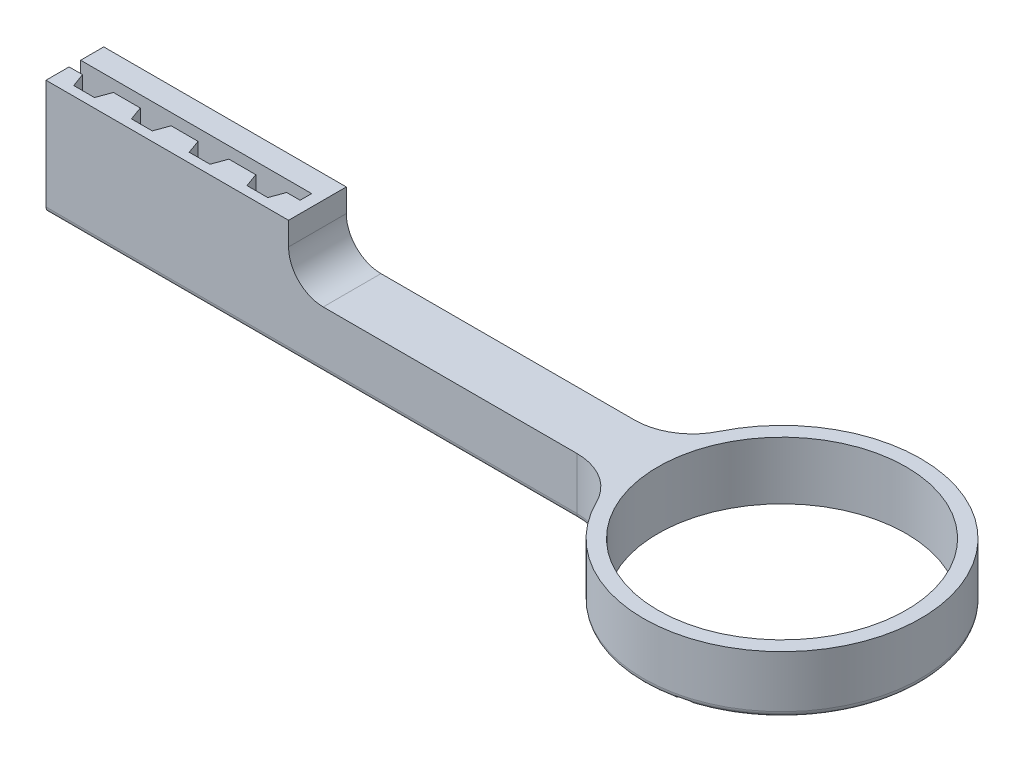
ISO-10303-21;
HEADER;
FILE_DESCRIPTION(('STEP AP214'),'2;1');
FILE_NAME('part.step','',(''),(''),'','','');
FILE_SCHEMA(('AUTOMOTIVE_DESIGN { 1 0 10303 214 1 1 1 1 }'));
ENDSEC;
DATA;
#1=APPLICATION_CONTEXT('core data for automotive mechanical design processes');
#2=APPLICATION_PROTOCOL_DEFINITION('international standard','automotive_design',2000,#1);
#3=PRODUCT_CONTEXT('',#1,'mechanical');
#4=PRODUCT('Part','Part','',(#3));
#5=PRODUCT_RELATED_PRODUCT_CATEGORY('part','',(#4));
#6=PRODUCT_DEFINITION_FORMATION('','',#4);
#7=PRODUCT_DEFINITION_CONTEXT('part definition',#1,'design');
#8=PRODUCT_DEFINITION('design','',#6,#7);
#9=PRODUCT_DEFINITION_SHAPE('','',#8);
#10=(LENGTH_UNIT() NAMED_UNIT(*) SI_UNIT(.MILLI.,.METRE.));
#11=(NAMED_UNIT(*) PLANE_ANGLE_UNIT() SI_UNIT($,.RADIAN.));
#12=(NAMED_UNIT(*) SI_UNIT($,.STERADIAN.) SOLID_ANGLE_UNIT());
#13=UNCERTAINTY_MEASURE_WITH_UNIT(LENGTH_MEASURE(1.E-05),#10,'distance_accuracy_value','');
#14=(GEOMETRIC_REPRESENTATION_CONTEXT(3) GLOBAL_UNCERTAINTY_ASSIGNED_CONTEXT((#13)) GLOBAL_UNIT_ASSIGNED_CONTEXT((#10,
#11,#12)) REPRESENTATION_CONTEXT('',''));
#15=CARTESIAN_POINT('',(0.,0.,0.));
#16=DIRECTION('',(0.,0.,1.));
#17=DIRECTION('',(1.,0.,0.));
#18=AXIS2_PLACEMENT_3D('',#15,#16,#17);
#19=CARTESIAN_POINT('',(-61.2249721603218,5.,-2.49999999999999));
#20=DIRECTION('',(1.,0.,0.));
#21=DIRECTION('',(0.,0.,-1.));
#22=AXIS2_PLACEMENT_3D('',#19,#20,#21);
#23=PLANE('',#22);
#24=DIRECTION('',(0.,-1.,0.));
#25=VECTOR('',#24,1.);
#26=CARTESIAN_POINT('',(-61.2249721603218,5.,-2.49999999999999));
#27=LINE('',#26,#25);
#28=CARTESIAN_POINT('',(-61.2249721603218,10.,-2.49999999999999));
#29=VERTEX_POINT('',#28);
#30=CARTESIAN_POINT('',(-61.2249721603218,0.5,-2.49999999999999));
#31=VERTEX_POINT('',#30);
#32=EDGE_CURVE('E437',#29,#31,#27,.T.);
#33=ORIENTED_EDGE('',*,*,#32,.T.);
#34=CARTESIAN_POINT('',(-61.2249721603218,0.5,-1.99999999999999));
#35=DIRECTION('',(1.,0.,0.));
#36=DIRECTION('',(0.,0.,-1.));
#37=AXIS2_PLACEMENT_3D('',#34,#35,#36);
#38=CIRCLE('',#37,0.5);
#39=CARTESIAN_POINT('',(-61.2249721603218,0.,-1.99999999999999));
#40=VERTEX_POINT('',#39);
#41=EDGE_CURVE('E487',#31,#40,#38,.F.);
#42=ORIENTED_EDGE('',*,*,#41,.T.);
#43=DIRECTION('',(0.,0.,1.));
#44=VECTOR('',#43,1.);
#45=CARTESIAN_POINT('',(-61.2249721603218,0.,-2.49999999999999));
#46=LINE('',#45,#44);
#47=CARTESIAN_POINT('',(-61.2249721603218,0.,-0.5));
#48=VERTEX_POINT('',#47);
#49=EDGE_CURVE('E430',#40,#48,#46,.T.);
#50=ORIENTED_EDGE('',*,*,#49,.T.);
#51=DIRECTION('',(0.,1.,0.));
#52=VECTOR('',#51,1.);
#53=CARTESIAN_POINT('',(-61.2249721603218,0.,-0.5));
#54=LINE('',#53,#52);
#55=CARTESIAN_POINT('',(-61.2249721603218,10.,-0.5));
#56=VERTEX_POINT('',#55);
#57=EDGE_CURVE('E371',#48,#56,#54,.T.);
#58=ORIENTED_EDGE('',*,*,#57,.T.);
#59=DIRECTION('',(0.,0.,1.));
#60=VECTOR('',#59,1.);
#61=CARTESIAN_POINT('',(-61.2249721603218,10.,-2.49999999999999));
#62=LINE('',#61,#60);
#63=EDGE_CURVE('E409',#29,#56,#62,.T.);
#64=ORIENTED_EDGE('',*,*,#63,.F.);
#65=EDGE_LOOP('',(#33,#42,#50,#58,#64));
#66=FACE_BOUND('',#65,.T.);
#67=ADVANCED_FACE('F31',(#66),#23,.F.);
#68=CARTESIAN_POINT('',(0.,5.,0.));
#69=DIRECTION('',(0.,1.,0.));
#70=DIRECTION('',(0.,0.,1.));
#71=AXIS2_PLACEMENT_3D('',#68,#69,#70);
#72=PLANE('',#71);
#73=CARTESIAN_POINT('',(0.,5.,0.));
#74=DIRECTION('',(0.,1.,0.));
#75=DIRECTION('',(0.,0.,1.));
#76=AXIS2_PLACEMENT_3D('',#73,#74,#75);
#77=CIRCLE('',#76,10.75);
#78=CARTESIAN_POINT('',(0.,5.,10.75));
#79=VERTEX_POINT('',#78);
#80=EDGE_CURVE('E440',#79,#79,#77,.T.);
#81=ORIENTED_EDGE('',*,*,#80,.F.);
#82=EDGE_LOOP('',(#81));
#83=FACE_BOUND('',#82,.T.);
#84=DIRECTION('',(-1.,0.,0.));
#85=VECTOR('',#84,1.);
#86=CARTESIAN_POINT('',(-11.2249721603218,5.,-2.49999999999999));
#87=LINE('',#86,#85);
#88=CARTESIAN_POINT('',(-15.2561463023924,5.,-2.49999999999999));
#89=VERTEX_POINT('',#88);
#90=CARTESIAN_POINT('',(-37.2249721603218,5.,-2.49999999999999));
#91=VERTEX_POINT('',#90);
#92=EDGE_CURVE('E426',#89,#91,#87,.T.);
#93=ORIENTED_EDGE('',*,*,#92,.T.);
#94=DIRECTION('',(0.,0.,1.));
#95=VECTOR('',#94,1.);
#96=CARTESIAN_POINT('',(-37.2249721603218,5.,0.));
#97=LINE('',#96,#95);
#98=CARTESIAN_POINT('',(-37.2249721603218,5.,2.50000000000001));
#99=VERTEX_POINT('',#98);
#100=EDGE_CURVE('E460',#91,#99,#97,.T.);
#101=ORIENTED_EDGE('',*,*,#100,.T.);
#102=DIRECTION('',(1.,0.,0.));
#103=VECTOR('',#102,1.);
#104=CARTESIAN_POINT('',(-11.2249721603218,5.,2.50000000000001));
#105=LINE('',#104,#103);
#106=CARTESIAN_POINT('',(-15.2561463023924,5.,2.50000000000001));
#107=VERTEX_POINT('',#106);
#108=EDGE_CURVE('E429',#99,#107,#105,.T.);
#109=ORIENTED_EDGE('',*,*,#108,.T.);
#110=CARTESIAN_POINT('',(-15.2561463023924,5.,7.50000000000001));
#111=DIRECTION('',(0.,1.,0.));
#112=DIRECTION('',(0.,0.,1.));
#113=AXIS2_PLACEMENT_3D('',#110,#111,#112);
#114=CIRCLE('',#113,5.);
#115=CARTESIAN_POINT('',(-10.7690444487475,5.,5.29411764705883));
#116=VERTEX_POINT('',#115);
#117=EDGE_CURVE('E456',#107,#116,#114,.F.);
#118=ORIENTED_EDGE('',*,*,#117,.T.);
#119=CARTESIAN_POINT('',(0.,5.,0.));
#120=DIRECTION('',(0.,1.,0.));
#121=DIRECTION('',(0.,0.,1.));
#122=AXIS2_PLACEMENT_3D('',#119,#120,#121);
#123=CIRCLE('',#122,12.);
#124=CARTESIAN_POINT('',(-10.7690444487476,5.,-5.29411764705882));
#125=VERTEX_POINT('',#124);
#126=EDGE_CURVE('E443',#116,#125,#123,.T.);
#127=ORIENTED_EDGE('',*,*,#126,.T.);
#128=CARTESIAN_POINT('',(-15.2561463023924,5.,-7.49999999999999));
#129=DIRECTION('',(0.,1.,0.));
#130=DIRECTION('',(0.,0.,1.));
#131=AXIS2_PLACEMENT_3D('',#128,#129,#130);
#132=CIRCLE('',#131,5.);
#133=EDGE_CURVE('E458',#125,#89,#132,.F.);
#134=ORIENTED_EDGE('',*,*,#133,.T.);
#135=EDGE_LOOP('',(#93,#101,#109,#118,#127,#134));
#136=FACE_BOUND('',#135,.T.);
#137=ADVANCED_FACE('F533',(#83,#136),#72,.T.);
#138=CARTESIAN_POINT('',(0.,5.,0.));
#139=DIRECTION('',(0.,-1.,0.));
#140=DIRECTION('',(0.,0.,-1.));
#141=AXIS2_PLACEMENT_3D('',#138,#139,#140);
#142=CYLINDRICAL_SURFACE('',#141,12.);
#143=DIRECTION('',(0.,-1.,0.));
#144=VECTOR('',#143,1.);
#145=CARTESIAN_POINT('',(-10.7690444487475,5.,5.29411764705883));
#146=LINE('',#145,#144);
#147=CARTESIAN_POINT('',(-10.7690444487475,0.5,5.29411764705883));
#148=VERTEX_POINT('',#147);
#149=EDGE_CURVE('E452',#116,#148,#146,.T.);
#150=ORIENTED_EDGE('',*,*,#149,.T.);
#151=CARTESIAN_POINT('',(0.,0.5,0.));
#152=DIRECTION('',(0.,1.,0.));
#153=DIRECTION('',(0.,0.,1.));
#154=AXIS2_PLACEMENT_3D('',#151,#152,#153);
#155=CIRCLE('',#154,12.);
#156=CARTESIAN_POINT('',(-10.7690444487476,0.5,-5.29411764705882));
#157=VERTEX_POINT('',#156);
#158=EDGE_CURVE('E11',#148,#157,#155,.T.);
#159=ORIENTED_EDGE('',*,*,#158,.T.);
#160=DIRECTION('',(0.,-1.,0.));
#161=VECTOR('',#160,1.);
#162=CARTESIAN_POINT('',(-10.7690444487476,5.,-5.29411764705882));
#163=LINE('',#162,#161);
#164=EDGE_CURVE('E450',#157,#125,#163,.F.);
#165=ORIENTED_EDGE('',*,*,#164,.T.);
#166=ORIENTED_EDGE('',*,*,#126,.F.);
#167=EDGE_LOOP('',(#150,#159,#165,#166));
#168=FACE_BOUND('',#167,.T.);
#169=ADVANCED_FACE('F546',(#168),#142,.T.);
#170=CARTESIAN_POINT('',(0.,0.,0.));
#171=DIRECTION('',(0.,1.,0.));
#172=DIRECTION('',(0.,0.,1.));
#173=AXIS2_PLACEMENT_3D('',#170,#171,#172);
#174=PLANE('',#173);
#175=CARTESIAN_POINT('',(-15.2561463023924,0.,7.50000000000001));
#176=DIRECTION('',(0.,1.,0.));
#177=DIRECTION('',(0.,0.,1.));
#178=AXIS2_PLACEMENT_3D('',#175,#176,#177);
#179=CIRCLE('',#178,5.5);
#180=CARTESIAN_POINT('',(-10.3203342633831,0.,5.07352941176471));
#181=VERTEX_POINT('',#180);
#182=CARTESIAN_POINT('',(-15.2561463023924,0.,2.00000000000001));
#183=VERTEX_POINT('',#182);
#184=EDGE_CURVE('E478',#181,#183,#179,.T.);
#185=ORIENTED_EDGE('',*,*,#184,.T.);
#186=DIRECTION('',(1.,0.,0.));
#187=VECTOR('',#186,1.);
#188=CARTESIAN_POINT('',(0.,0.,2.));
#189=LINE('',#188,#187);
#190=CARTESIAN_POINT('',(-61.2249721603218,0.,2.00000000000001));
#191=VERTEX_POINT('',#190);
#192=EDGE_CURVE('E480',#183,#191,#189,.F.);
#193=ORIENTED_EDGE('',*,*,#192,.T.);
#194=CARTESIAN_POINT('',(-61.2249721603218,0.,0.500000000000014));
#195=VERTEX_POINT('',#194);
#196=EDGE_CURVE('E425',#195,#191,#46,.T.);
#197=ORIENTED_EDGE('',*,*,#196,.F.);
#198=DIRECTION('',(1.,0.,0.));
#199=VECTOR('',#198,1.);
#200=CARTESIAN_POINT('',(-60.0617364414413,0.,0.500000000000014));
#201=LINE('',#200,#199);
#202=CARTESIAN_POINT('',(-60.0617364414413,0.,0.500000000000014));
#203=VERTEX_POINT('',#202);
#204=EDGE_CURVE('E317',#195,#203,#201,.T.);
#205=ORIENTED_EDGE('',*,*,#204,.T.);
#206=DIRECTION('',(0.342020143325666,0.,0.939692620785909));
#207=VECTOR('',#206,1.);
#208=CARTESIAN_POINT('',(-60.0617364414413,0.,0.500000000000014));
#209=LINE('',#208,#207);
#210=CARTESIAN_POINT('',(-59.6249721603218,0.,1.70000000000001));
#211=VERTEX_POINT('',#210);
#212=EDGE_CURVE('E249',#203,#211,#209,.T.);
#213=ORIENTED_EDGE('',*,*,#212,.T.);
#214=DIRECTION('',(1.,0.,0.));
#215=VECTOR('',#214,1.);
#216=CARTESIAN_POINT('',(-59.6249721603218,0.,1.70000000000001));
#217=LINE('',#216,#215);
#218=CARTESIAN_POINT('',(-57.8249721603218,0.,1.70000000000001));
#219=VERTEX_POINT('',#218);
#220=EDGE_CURVE('E320',#211,#219,#217,.T.);
#221=ORIENTED_EDGE('',*,*,#220,.T.);
#222=DIRECTION('',(0.342020143325666,0.,-0.939692620785909));
#223=VECTOR('',#222,1.);
#224=CARTESIAN_POINT('',(-57.8249721603218,0.,1.70000000000001));
#225=LINE('',#224,#223);
#226=CARTESIAN_POINT('',(-57.3882078792024,0.,0.500000000000014));
#227=VERTEX_POINT('',#226);
#228=EDGE_CURVE('E323',#219,#227,#225,.T.);
#229=ORIENTED_EDGE('',*,*,#228,.T.);
#230=DIRECTION('',(1.,0.,0.));
#231=VECTOR('',#230,1.);
#232=CARTESIAN_POINT('',(-57.3882078792024,0.,0.500000000000014));
#233=LINE('',#232,#231);
#234=CARTESIAN_POINT('',(-55.0617364414413,0.,0.500000000000014));
#235=VERTEX_POINT('',#234);
#236=EDGE_CURVE('E326',#227,#235,#233,.T.);
#237=ORIENTED_EDGE('',*,*,#236,.T.);
#238=DIRECTION('',(0.342020143325666,0.,0.939692620785909));
#239=VECTOR('',#238,1.);
#240=CARTESIAN_POINT('',(-55.0617364414413,0.,0.500000000000014));
#241=LINE('',#240,#239);
#242=CARTESIAN_POINT('',(-54.6249721603218,0.,1.70000000000001));
#243=VERTEX_POINT('',#242);
#244=EDGE_CURVE('E329',#235,#243,#241,.T.);
#245=ORIENTED_EDGE('',*,*,#244,.T.);
#246=DIRECTION('',(1.,0.,0.));
#247=VECTOR('',#246,1.);
#248=CARTESIAN_POINT('',(-54.6249721603218,0.,1.70000000000001));
#249=LINE('',#248,#247);
#250=CARTESIAN_POINT('',(-52.8249721603218,0.,1.70000000000001));
#251=VERTEX_POINT('',#250);
#252=EDGE_CURVE('E332',#243,#251,#249,.T.);
#253=ORIENTED_EDGE('',*,*,#252,.T.);
#254=DIRECTION('',(0.342020143325666,0.,-0.939692620785909));
#255=VECTOR('',#254,1.);
#256=CARTESIAN_POINT('',(-52.8249721603218,0.,1.70000000000001));
#257=LINE('',#256,#255);
#258=CARTESIAN_POINT('',(-52.3882078792024,0.,0.500000000000014));
#259=VERTEX_POINT('',#258);
#260=EDGE_CURVE('E335',#251,#259,#257,.T.);
#261=ORIENTED_EDGE('',*,*,#260,.T.);
#262=DIRECTION('',(1.,0.,0.));
#263=VECTOR('',#262,1.);
#264=CARTESIAN_POINT('',(-52.3882078792024,0.,0.500000000000014));
#265=LINE('',#264,#263);
#266=CARTESIAN_POINT('',(-50.0617364414413,0.,0.500000000000014));
#267=VERTEX_POINT('',#266);
#268=EDGE_CURVE('E338',#259,#267,#265,.T.);
#269=ORIENTED_EDGE('',*,*,#268,.T.);
#270=DIRECTION('',(0.342020143325666,0.,0.939692620785909));
#271=VECTOR('',#270,1.);
#272=CARTESIAN_POINT('',(-50.0617364414413,0.,0.500000000000014));
#273=LINE('',#272,#271);
#274=CARTESIAN_POINT('',(-49.6249721603218,0.,1.70000000000001));
#275=VERTEX_POINT('',#274);
#276=EDGE_CURVE('E341',#267,#275,#273,.T.);
#277=ORIENTED_EDGE('',*,*,#276,.T.);
#278=DIRECTION('',(1.,0.,0.));
#279=VECTOR('',#278,1.);
#280=CARTESIAN_POINT('',(-49.6249721603218,0.,1.70000000000001));
#281=LINE('',#280,#279);
#282=CARTESIAN_POINT('',(-47.8249721603218,0.,1.70000000000001));
#283=VERTEX_POINT('',#282);
#284=EDGE_CURVE('E344',#275,#283,#281,.T.);
#285=ORIENTED_EDGE('',*,*,#284,.T.);
#286=DIRECTION('',(0.342020143325666,0.,-0.939692620785909));
#287=VECTOR('',#286,1.);
#288=CARTESIAN_POINT('',(-47.8249721603218,0.,1.70000000000001));
#289=LINE('',#288,#287);
#290=CARTESIAN_POINT('',(-47.3882078792024,0.,0.500000000000014));
#291=VERTEX_POINT('',#290);
#292=EDGE_CURVE('E347',#283,#291,#289,.T.);
#293=ORIENTED_EDGE('',*,*,#292,.T.);
#294=DIRECTION('',(1.,0.,0.));
#295=VECTOR('',#294,1.);
#296=CARTESIAN_POINT('',(-47.3882078792024,0.,0.500000000000014));
#297=LINE('',#296,#295);
#298=CARTESIAN_POINT('',(-45.0617364414413,0.,0.500000000000014));
#299=VERTEX_POINT('',#298);
#300=EDGE_CURVE('E350',#291,#299,#297,.T.);
#301=ORIENTED_EDGE('',*,*,#300,.T.);
#302=DIRECTION('',(0.342020143325666,0.,0.939692620785909));
#303=VECTOR('',#302,1.);
#304=CARTESIAN_POINT('',(-45.0617364414413,0.,0.500000000000014));
#305=LINE('',#304,#303);
#306=CARTESIAN_POINT('',(-44.6249721603218,0.,1.70000000000001));
#307=VERTEX_POINT('',#306);
#308=EDGE_CURVE('E353',#299,#307,#305,.T.);
#309=ORIENTED_EDGE('',*,*,#308,.T.);
#310=DIRECTION('',(1.,0.,0.));
#311=VECTOR('',#310,1.);
#312=CARTESIAN_POINT('',(-44.6249721603218,0.,1.70000000000001));
#313=LINE('',#312,#311);
#314=CARTESIAN_POINT('',(-42.8249721603218,0.,1.70000000000001));
#315=VERTEX_POINT('',#314);
#316=EDGE_CURVE('E356',#307,#315,#313,.T.);
#317=ORIENTED_EDGE('',*,*,#316,.T.);
#318=DIRECTION('',(0.342020143325666,0.,-0.939692620785909));
#319=VECTOR('',#318,1.);
#320=CARTESIAN_POINT('',(-42.8249721603218,0.,1.70000000000001));
#321=LINE('',#320,#319);
#322=CARTESIAN_POINT('',(-42.3882078792024,0.,0.500000000000014));
#323=VERTEX_POINT('',#322);
#324=EDGE_CURVE('E359',#315,#323,#321,.T.);
#325=ORIENTED_EDGE('',*,*,#324,.T.);
#326=DIRECTION('',(1.,0.,0.));
#327=VECTOR('',#326,1.);
#328=CARTESIAN_POINT('',(-42.3882078792024,0.,0.500000000000014));
#329=LINE('',#328,#327);
#330=CARTESIAN_POINT('',(-41.2249721603218,0.,0.500000000000014));
#331=VERTEX_POINT('',#330);
#332=EDGE_CURVE('E362',#323,#331,#329,.T.);
#333=ORIENTED_EDGE('',*,*,#332,.T.);
#334=DIRECTION('',(0.,0.,-1.));
#335=VECTOR('',#334,1.);
#336=CARTESIAN_POINT('',(-41.2249721603218,0.,-0.5));
#337=LINE('',#336,#335);
#338=CARTESIAN_POINT('',(-41.2249721603218,0.,-0.5));
#339=VERTEX_POINT('',#338);
#340=EDGE_CURVE('E365',#331,#339,#337,.T.);
#341=ORIENTED_EDGE('',*,*,#340,.T.);
#342=DIRECTION('',(-1.,0.,0.));
#343=VECTOR('',#342,1.);
#344=CARTESIAN_POINT('',(-61.2249721603218,0.,-0.5));
#345=LINE('',#344,#343);
#346=EDGE_CURVE('E368',#339,#48,#345,.T.);
#347=ORIENTED_EDGE('',*,*,#346,.T.);
#348=ORIENTED_EDGE('',*,*,#49,.F.);
#349=DIRECTION('',(-1.,0.,0.));
#350=VECTOR('',#349,1.);
#351=CARTESIAN_POINT('',(0.,0.,-2.));
#352=LINE('',#351,#350);
#353=CARTESIAN_POINT('',(-15.2561463023924,0.,-1.99999999999999));
#354=VERTEX_POINT('',#353);
#355=EDGE_CURVE('E476',#40,#354,#352,.F.);
#356=ORIENTED_EDGE('',*,*,#355,.T.);
#357=CARTESIAN_POINT('',(-15.2561463023924,0.,-7.49999999999999));
#358=DIRECTION('',(0.,1.,0.));
#359=DIRECTION('',(0.,0.,1.));
#360=AXIS2_PLACEMENT_3D('',#357,#358,#359);
#361=CIRCLE('',#360,5.5);
#362=CARTESIAN_POINT('',(-10.3203342633831,0.,-5.0735294117647));
#363=VERTEX_POINT('',#362);
#364=EDGE_CURVE('E474',#354,#363,#361,.T.);
#365=ORIENTED_EDGE('',*,*,#364,.T.);
#366=CARTESIAN_POINT('',(0.,0.,0.));
#367=DIRECTION('',(0.,1.,0.));
#368=DIRECTION('',(0.,0.,1.));
#369=AXIS2_PLACEMENT_3D('',#366,#367,#368);
#370=CIRCLE('',#369,11.5);
#371=EDGE_CURVE('E472',#363,#181,#370,.F.);
#372=ORIENTED_EDGE('',*,*,#371,.T.);
#373=EDGE_LOOP('',(#185,#193,#197,#205,#213,#221,#229,#237,#245,#253,#261,#269,#277,#285,#293,
#301,#309,#317,#325,#333,#341,#347,#348,#356,#365,#372));
#374=FACE_BOUND('',#373,.T.);
#375=CARTESIAN_POINT('',(0.,0.,0.));
#376=DIRECTION('',(0.,1.,0.));
#377=DIRECTION('',(0.,0.,1.));
#378=AXIS2_PLACEMENT_3D('',#375,#376,#377);
#379=CIRCLE('',#378,10.75);
#380=CARTESIAN_POINT('',(0.,0.,10.75));
#381=VERTEX_POINT('',#380);
#382=EDGE_CURVE('E439',#381,#381,#379,.T.);
#383=ORIENTED_EDGE('',*,*,#382,.T.);
#384=EDGE_LOOP('',(#383));
#385=FACE_BOUND('',#384,.T.);
#386=ADVANCED_FACE('F513',(#374,#385),#174,.F.);
#387=CARTESIAN_POINT('',(0.,5.,0.));
#388=DIRECTION('',(0.,-1.,0.));
#389=DIRECTION('',(0.,0.,-1.));
#390=AXIS2_PLACEMENT_3D('',#387,#388,#389);
#391=CYLINDRICAL_SURFACE('',#390,10.75);
#392=ORIENTED_EDGE('',*,*,#80,.T.);
#393=EDGE_LOOP('',(#392));
#394=FACE_BOUND('',#393,.T.);
#395=ORIENTED_EDGE('',*,*,#382,.F.);
#396=EDGE_LOOP('',(#395));
#397=FACE_BOUND('',#396,.T.);
#398=ADVANCED_FACE('F814',(#394,#397),#391,.F.);
#399=CARTESIAN_POINT('',(-11.2249721603218,5.,-2.49999999999999));
#400=DIRECTION('',(0.,0.,1.));
#401=DIRECTION('',(1.,0.,0.));
#402=AXIS2_PLACEMENT_3D('',#399,#400,#401);
#403=PLANE('',#402);
#404=DIRECTION('',(0.,1.,0.));
#405=VECTOR('',#404,1.);
#406=CARTESIAN_POINT('',(-15.2561463023924,0.,-2.49999999999999));
#407=LINE('',#406,#405);
#408=CARTESIAN_POINT('',(-15.2561463023924,0.5,-2.49999999999999));
#409=VERTEX_POINT('',#408);
#410=EDGE_CURVE('E454',#89,#409,#407,.F.);
#411=ORIENTED_EDGE('',*,*,#410,.T.);
#412=DIRECTION('',(-1.,0.,0.));
#413=VECTOR('',#412,1.);
#414=CARTESIAN_POINT('',(-11.2249721603218,0.5,-2.49999999999999));
#415=LINE('',#414,#413);
#416=EDGE_CURVE('E54',#409,#31,#415,.T.);
#417=ORIENTED_EDGE('',*,*,#416,.T.);
#418=ORIENTED_EDGE('',*,*,#32,.F.);
#419=DIRECTION('',(-1.,0.,0.));
#420=VECTOR('',#419,1.);
#421=CARTESIAN_POINT('',(-61.2249721603218,10.,-2.49999999999999));
#422=LINE('',#421,#420);
#423=CARTESIAN_POINT('',(-40.2249721603218,10.,-2.49999999999999));
#424=VERTEX_POINT('',#423);
#425=EDGE_CURVE('E416',#424,#29,#422,.T.);
#426=ORIENTED_EDGE('',*,*,#425,.F.);
#427=DIRECTION('',(0.,-1.,0.));
#428=VECTOR('',#427,1.);
#429=CARTESIAN_POINT('',(-40.2249721603218,10.,-2.49999999999999));
#430=LINE('',#429,#428);
#431=CARTESIAN_POINT('',(-40.2249721603218,8.,-2.49999999999999));
#432=VERTEX_POINT('',#431);
#433=EDGE_CURVE('E419',#424,#432,#430,.T.);
#434=ORIENTED_EDGE('',*,*,#433,.T.);
#435=CARTESIAN_POINT('',(-37.2249721603218,8.,-2.49999999999999));
#436=DIRECTION('',(0.,0.,1.));
#437=DIRECTION('',(1.,0.,0.));
#438=AXIS2_PLACEMENT_3D('',#435,#436,#437);
#439=CIRCLE('',#438,3.);
#440=EDGE_CURVE('E467',#432,#91,#439,.T.);
#441=ORIENTED_EDGE('',*,*,#440,.T.);
#442=ORIENTED_EDGE('',*,*,#92,.F.);
#443=EDGE_LOOP('',(#411,#417,#418,#426,#434,#441,#442));
#444=FACE_BOUND('',#443,.T.);
#445=ADVANCED_FACE('F523',(#444),#403,.F.);
#446=CARTESIAN_POINT('',(-11.2249721603218,5.,2.50000000000001));
#447=DIRECTION('',(0.,0.,-1.));
#448=DIRECTION('',(-1.,0.,0.));
#449=AXIS2_PLACEMENT_3D('',#446,#447,#448);
#450=PLANE('',#449);
#451=DIRECTION('',(0.,-1.,0.));
#452=VECTOR('',#451,1.);
#453=CARTESIAN_POINT('',(-61.2249721603218,5.,2.50000000000001));
#454=LINE('',#453,#452);
#455=CARTESIAN_POINT('',(-61.2249721603218,10.,2.50000000000001));
#456=VERTEX_POINT('',#455);
#457=CARTESIAN_POINT('',(-61.2249721603218,0.5,2.50000000000001));
#458=VERTEX_POINT('',#457);
#459=EDGE_CURVE('E433',#456,#458,#454,.T.);
#460=ORIENTED_EDGE('',*,*,#459,.T.);
#461=DIRECTION('',(1.,0.,0.));
#462=VECTOR('',#461,1.);
#463=CARTESIAN_POINT('',(-11.2249721603218,0.5,2.50000000000001));
#464=LINE('',#463,#462);
#465=CARTESIAN_POINT('',(-15.2561463023924,0.5,2.50000000000001));
#466=VERTEX_POINT('',#465);
#467=EDGE_CURVE('E469',#458,#466,#464,.T.);
#468=ORIENTED_EDGE('',*,*,#467,.T.);
#469=DIRECTION('',(0.,1.,0.));
#470=VECTOR('',#469,1.);
#471=CARTESIAN_POINT('',(-15.2561463023924,5.,2.50000000000001));
#472=LINE('',#471,#470);
#473=EDGE_CURVE('E448',#466,#107,#472,.T.);
#474=ORIENTED_EDGE('',*,*,#473,.T.);
#475=ORIENTED_EDGE('',*,*,#108,.F.);
#476=CARTESIAN_POINT('',(-37.2249721603218,8.,2.50000000000001));
#477=DIRECTION('',(0.,0.,-1.));
#478=DIRECTION('',(-1.,0.,0.));
#479=AXIS2_PLACEMENT_3D('',#476,#477,#478);
#480=CIRCLE('',#479,3.);
#481=CARTESIAN_POINT('',(-40.2249721603218,8.,2.50000000000001));
#482=VERTEX_POINT('',#481);
#483=EDGE_CURVE('E465',#99,#482,#480,.T.);
#484=ORIENTED_EDGE('',*,*,#483,.T.);
#485=DIRECTION('',(0.,-1.,0.));
#486=VECTOR('',#485,1.);
#487=CARTESIAN_POINT('',(-40.2249721603218,10.,2.50000000000001));
#488=LINE('',#487,#486);
#489=CARTESIAN_POINT('',(-40.2249721603218,10.,2.50000000000001));
#490=VERTEX_POINT('',#489);
#491=EDGE_CURVE('E422',#490,#482,#488,.T.);
#492=ORIENTED_EDGE('',*,*,#491,.F.);
#493=DIRECTION('',(1.,0.,0.));
#494=VECTOR('',#493,1.);
#495=CARTESIAN_POINT('',(-61.2249721603218,10.,2.50000000000001));
#496=LINE('',#495,#494);
#497=EDGE_CURVE('E412',#456,#490,#496,.T.);
#498=ORIENTED_EDGE('',*,*,#497,.F.);
#499=EDGE_LOOP('',(#460,#468,#474,#475,#484,#492,#498));
#500=FACE_BOUND('',#499,.T.);
#501=ADVANCED_FACE('F536',(#500),#450,.F.);
#502=ORIENTED_EDGE('',*,*,#196,.T.);
#503=CARTESIAN_POINT('',(-61.2249721603218,0.5,2.00000000000001));
#504=DIRECTION('',(1.,0.,0.));
#505=DIRECTION('',(0.,0.,-1.));
#506=AXIS2_PLACEMENT_3D('',#503,#504,#505);
#507=CIRCLE('',#506,0.5);
#508=EDGE_CURVE('E482',#191,#458,#507,.F.);
#509=ORIENTED_EDGE('',*,*,#508,.T.);
#510=ORIENTED_EDGE('',*,*,#459,.F.);
#511=CARTESIAN_POINT('',(-61.2249721603218,10.,0.500000000000014));
#512=VERTEX_POINT('',#511);
#513=EDGE_CURVE('E374',#512,#456,#62,.T.);
#514=ORIENTED_EDGE('',*,*,#513,.F.);
#515=DIRECTION('',(0.,1.,0.));
#516=VECTOR('',#515,1.);
#517=CARTESIAN_POINT('',(-61.2249721603218,0.,0.500000000000014));
#518=LINE('',#517,#516);
#519=EDGE_CURVE('E253',#195,#512,#518,.T.);
#520=ORIENTED_EDGE('',*,*,#519,.F.);
#521=EDGE_LOOP('',(#502,#509,#510,#514,#520));
#522=FACE_BOUND('',#521,.T.);
#523=ADVANCED_FACE('F561',(#522),#23,.F.);
#524=CARTESIAN_POINT('',(-40.2249721603218,10.,-2.49999999999999));
#525=DIRECTION('',(-1.,0.,0.));
#526=DIRECTION('',(0.,0.,1.));
#527=AXIS2_PLACEMENT_3D('',#524,#525,#526);
#528=PLANE('',#527);
#529=ORIENTED_EDGE('',*,*,#491,.T.);
#530=DIRECTION('',(0.,0.,1.));
#531=VECTOR('',#530,1.);
#532=CARTESIAN_POINT('',(-40.2249721603218,8.,-2.49999999999999));
#533=LINE('',#532,#531);
#534=EDGE_CURVE('E463',#482,#432,#533,.F.);
#535=ORIENTED_EDGE('',*,*,#534,.T.);
#536=ORIENTED_EDGE('',*,*,#433,.F.);
#537=DIRECTION('',(0.,0.,-1.));
#538=VECTOR('',#537,1.);
#539=CARTESIAN_POINT('',(-40.2249721603218,10.,-2.49999999999999));
#540=LINE('',#539,#538);
#541=EDGE_CURVE('E414',#490,#424,#540,.T.);
#542=ORIENTED_EDGE('',*,*,#541,.F.);
#543=EDGE_LOOP('',(#529,#535,#536,#542));
#544=FACE_BOUND('',#543,.T.);
#545=ADVANCED_FACE('F572',(#544),#528,.F.);
#546=CARTESIAN_POINT('',(-61.2249721603218,10.,2.50000000000001));
#547=DIRECTION('',(0.,1.,0.));
#548=DIRECTION('',(0.,0.,1.));
#549=AXIS2_PLACEMENT_3D('',#546,#547,#548);
#550=PLANE('',#549);
#551=DIRECTION('',(-1.,0.,0.));
#552=VECTOR('',#551,1.);
#553=CARTESIAN_POINT('',(-61.2249721603218,10.,-0.5));
#554=LINE('',#553,#552);
#555=CARTESIAN_POINT('',(-41.2249721603218,10.,-0.5));
#556=VERTEX_POINT('',#555);
#557=EDGE_CURVE('E315',#556,#56,#554,.T.);
#558=ORIENTED_EDGE('',*,*,#557,.F.);
#559=DIRECTION('',(0.,0.,-1.));
#560=VECTOR('',#559,1.);
#561=CARTESIAN_POINT('',(-41.2249721603218,10.,-0.5));
#562=LINE('',#561,#560);
#563=CARTESIAN_POINT('',(-41.2249721603218,10.,0.500000000000014));
#564=VERTEX_POINT('',#563);
#565=EDGE_CURVE('E312',#564,#556,#562,.T.);
#566=ORIENTED_EDGE('',*,*,#565,.F.);
#567=DIRECTION('',(1.,0.,0.));
#568=VECTOR('',#567,1.);
#569=CARTESIAN_POINT('',(-42.3882078792024,10.,0.500000000000014));
#570=LINE('',#569,#568);
#571=CARTESIAN_POINT('',(-42.3882078792024,10.,0.500000000000014));
#572=VERTEX_POINT('',#571);
#573=EDGE_CURVE('E309',#572,#564,#570,.T.);
#574=ORIENTED_EDGE('',*,*,#573,.F.);
#575=DIRECTION('',(0.342020143325666,0.,-0.939692620785909));
#576=VECTOR('',#575,1.);
#577=CARTESIAN_POINT('',(-42.8249721603218,10.,1.70000000000001));
#578=LINE('',#577,#576);
#579=CARTESIAN_POINT('',(-42.8249721603218,10.,1.70000000000001));
#580=VERTEX_POINT('',#579);
#581=EDGE_CURVE('E306',#580,#572,#578,.T.);
#582=ORIENTED_EDGE('',*,*,#581,.F.);
#583=DIRECTION('',(1.,0.,0.));
#584=VECTOR('',#583,1.);
#585=CARTESIAN_POINT('',(-44.6249721603218,10.,1.70000000000001));
#586=LINE('',#585,#584);
#587=CARTESIAN_POINT('',(-44.6249721603218,10.,1.70000000000001));
#588=VERTEX_POINT('',#587);
#589=EDGE_CURVE('E303',#588,#580,#586,.T.);
#590=ORIENTED_EDGE('',*,*,#589,.F.);
#591=DIRECTION('',(0.342020143325666,0.,0.939692620785909));
#592=VECTOR('',#591,1.);
#593=CARTESIAN_POINT('',(-45.0617364414413,10.,0.500000000000014));
#594=LINE('',#593,#592);
#595=CARTESIAN_POINT('',(-45.0617364414413,10.,0.500000000000014));
#596=VERTEX_POINT('',#595);
#597=EDGE_CURVE('E300',#596,#588,#594,.T.);
#598=ORIENTED_EDGE('',*,*,#597,.F.);
#599=DIRECTION('',(1.,0.,0.));
#600=VECTOR('',#599,1.);
#601=CARTESIAN_POINT('',(-47.3882078792024,10.,0.500000000000014));
#602=LINE('',#601,#600);
#603=CARTESIAN_POINT('',(-47.3882078792024,10.,0.500000000000014));
#604=VERTEX_POINT('',#603);
#605=EDGE_CURVE('E297',#604,#596,#602,.T.);
#606=ORIENTED_EDGE('',*,*,#605,.F.);
#607=DIRECTION('',(0.342020143325666,0.,-0.939692620785909));
#608=VECTOR('',#607,1.);
#609=CARTESIAN_POINT('',(-47.8249721603218,10.,1.70000000000001));
#610=LINE('',#609,#608);
#611=CARTESIAN_POINT('',(-47.8249721603218,10.,1.70000000000001));
#612=VERTEX_POINT('',#611);
#613=EDGE_CURVE('E294',#612,#604,#610,.T.);
#614=ORIENTED_EDGE('',*,*,#613,.F.);
#615=DIRECTION('',(1.,0.,0.));
#616=VECTOR('',#615,1.);
#617=CARTESIAN_POINT('',(-49.6249721603218,10.,1.70000000000001));
#618=LINE('',#617,#616);
#619=CARTESIAN_POINT('',(-49.6249721603218,10.,1.70000000000001));
#620=VERTEX_POINT('',#619);
#621=EDGE_CURVE('E291',#620,#612,#618,.T.);
#622=ORIENTED_EDGE('',*,*,#621,.F.);
#623=DIRECTION('',(0.342020143325666,0.,0.939692620785909));
#624=VECTOR('',#623,1.);
#625=CARTESIAN_POINT('',(-50.0617364414413,10.,0.500000000000014));
#626=LINE('',#625,#624);
#627=CARTESIAN_POINT('',(-50.0617364414413,10.,0.500000000000014));
#628=VERTEX_POINT('',#627);
#629=EDGE_CURVE('E288',#628,#620,#626,.T.);
#630=ORIENTED_EDGE('',*,*,#629,.F.);
#631=DIRECTION('',(1.,0.,0.));
#632=VECTOR('',#631,1.);
#633=CARTESIAN_POINT('',(-52.3882078792024,10.,0.500000000000014));
#634=LINE('',#633,#632);
#635=CARTESIAN_POINT('',(-52.3882078792024,10.,0.500000000000014));
#636=VERTEX_POINT('',#635);
#637=EDGE_CURVE('E285',#636,#628,#634,.T.);
#638=ORIENTED_EDGE('',*,*,#637,.F.);
#639=DIRECTION('',(0.342020143325666,0.,-0.939692620785909));
#640=VECTOR('',#639,1.);
#641=CARTESIAN_POINT('',(-52.8249721603218,10.,1.70000000000001));
#642=LINE('',#641,#640);
#643=CARTESIAN_POINT('',(-52.8249721603218,10.,1.70000000000001));
#644=VERTEX_POINT('',#643);
#645=EDGE_CURVE('E282',#644,#636,#642,.T.);
#646=ORIENTED_EDGE('',*,*,#645,.F.);
#647=DIRECTION('',(1.,0.,0.));
#648=VECTOR('',#647,1.);
#649=CARTESIAN_POINT('',(-54.6249721603218,10.,1.70000000000001));
#650=LINE('',#649,#648);
#651=CARTESIAN_POINT('',(-54.6249721603218,10.,1.70000000000001));
#652=VERTEX_POINT('',#651);
#653=EDGE_CURVE('E279',#652,#644,#650,.T.);
#654=ORIENTED_EDGE('',*,*,#653,.F.);
#655=DIRECTION('',(0.342020143325666,0.,0.939692620785909));
#656=VECTOR('',#655,1.);
#657=CARTESIAN_POINT('',(-55.0617364414413,10.,0.500000000000014));
#658=LINE('',#657,#656);
#659=CARTESIAN_POINT('',(-55.0617364414413,10.,0.500000000000014));
#660=VERTEX_POINT('',#659);
#661=EDGE_CURVE('E276',#660,#652,#658,.T.);
#662=ORIENTED_EDGE('',*,*,#661,.F.);
#663=DIRECTION('',(1.,0.,0.));
#664=VECTOR('',#663,1.);
#665=CARTESIAN_POINT('',(-57.3882078792024,10.,0.500000000000014));
#666=LINE('',#665,#664);
#667=CARTESIAN_POINT('',(-57.3882078792024,10.,0.500000000000014));
#668=VERTEX_POINT('',#667);
#669=EDGE_CURVE('E273',#668,#660,#666,.T.);
#670=ORIENTED_EDGE('',*,*,#669,.F.);
#671=DIRECTION('',(0.342020143325666,0.,-0.939692620785909));
#672=VECTOR('',#671,1.);
#673=CARTESIAN_POINT('',(-57.8249721603218,10.,1.70000000000001));
#674=LINE('',#673,#672);
#675=CARTESIAN_POINT('',(-57.8249721603218,10.,1.70000000000001));
#676=VERTEX_POINT('',#675);
#677=EDGE_CURVE('E268',#676,#668,#674,.T.);
#678=ORIENTED_EDGE('',*,*,#677,.F.);
#679=DIRECTION('',(1.,0.,0.));
#680=VECTOR('',#679,1.);
#681=CARTESIAN_POINT('',(-59.6249721603218,10.,1.70000000000001));
#682=LINE('',#681,#680);
#683=CARTESIAN_POINT('',(-59.6249721603218,10.,1.70000000000001));
#684=VERTEX_POINT('',#683);
#685=EDGE_CURVE('E266',#684,#676,#682,.T.);
#686=ORIENTED_EDGE('',*,*,#685,.F.);
#687=DIRECTION('',(0.342020143325666,0.,0.939692620785909));
#688=VECTOR('',#687,1.);
#689=CARTESIAN_POINT('',(-60.0617364414413,10.,0.500000000000014));
#690=LINE('',#689,#688);
#691=CARTESIAN_POINT('',(-60.0617364414413,10.,0.500000000000014));
#692=VERTEX_POINT('',#691);
#693=EDGE_CURVE('E246',#692,#684,#690,.T.);
#694=ORIENTED_EDGE('',*,*,#693,.F.);
#695=DIRECTION('',(1.,0.,0.));
#696=VECTOR('',#695,1.);
#697=CARTESIAN_POINT('',(-60.0617364414413,10.,0.500000000000014));
#698=LINE('',#697,#696);
#699=EDGE_CURVE('E256',#512,#692,#698,.T.);
#700=ORIENTED_EDGE('',*,*,#699,.F.);
#701=ORIENTED_EDGE('',*,*,#513,.T.);
#702=ORIENTED_EDGE('',*,*,#497,.T.);
#703=ORIENTED_EDGE('',*,*,#541,.T.);
#704=ORIENTED_EDGE('',*,*,#425,.T.);
#705=ORIENTED_EDGE('',*,*,#63,.T.);
#706=EDGE_LOOP('',(#558,#566,#574,#582,#590,#598,#606,#614,#622,#630,#638,#646,#654,#662,#670,
#678,#686,#694,#700,#701,#702,#703,#704,#705));
#707=FACE_BOUND('',#706,.T.);
#708=ADVANCED_FACE('F263',(#707),#550,.T.);
#709=CARTESIAN_POINT('',(-15.2561463023924,5.,7.50000000000001));
#710=DIRECTION('',(0.,-1.,0.));
#711=DIRECTION('',(0.,0.,-1.));
#712=AXIS2_PLACEMENT_3D('',#709,#710,#711);
#713=CYLINDRICAL_SURFACE('',#712,5.);
#714=ORIENTED_EDGE('',*,*,#473,.F.);
#715=CARTESIAN_POINT('',(-15.2561463023924,0.5,7.50000000000001));
#716=DIRECTION('',(0.,1.,0.));
#717=DIRECTION('',(0.,0.,1.));
#718=AXIS2_PLACEMENT_3D('',#715,#716,#717);
#719=CIRCLE('',#718,5.);
#720=EDGE_CURVE('E484',#466,#148,#719,.F.);
#721=ORIENTED_EDGE('',*,*,#720,.T.);
#722=ORIENTED_EDGE('',*,*,#149,.F.);
#723=ORIENTED_EDGE('',*,*,#117,.F.);
#724=EDGE_LOOP('',(#714,#721,#722,#723));
#725=FACE_BOUND('',#724,.T.);
#726=ADVANCED_FACE('F541',(#725),#713,.F.);
#727=CARTESIAN_POINT('',(-15.2561463023924,5.,-7.49999999999999));
#728=DIRECTION('',(0.,-1.,0.));
#729=DIRECTION('',(0.,0.,-1.));
#730=AXIS2_PLACEMENT_3D('',#727,#728,#729);
#731=CYLINDRICAL_SURFACE('',#730,5.);
#732=ORIENTED_EDGE('',*,*,#164,.F.);
#733=CARTESIAN_POINT('',(-15.2561463023924,0.5,-7.49999999999999));
#734=DIRECTION('',(0.,1.,0.));
#735=DIRECTION('',(0.,0.,1.));
#736=AXIS2_PLACEMENT_3D('',#733,#734,#735);
#737=CIRCLE('',#736,5.);
#738=EDGE_CURVE('E40',#157,#409,#737,.F.);
#739=ORIENTED_EDGE('',*,*,#738,.T.);
#740=ORIENTED_EDGE('',*,*,#410,.F.);
#741=ORIENTED_EDGE('',*,*,#133,.F.);
#742=EDGE_LOOP('',(#732,#739,#740,#741));
#743=FACE_BOUND('',#742,.T.);
#744=ADVANCED_FACE('F548',(#743),#731,.F.);
#745=CARTESIAN_POINT('',(-37.2249721603218,8.,0.));
#746=DIRECTION('',(0.,0.,1.));
#747=DIRECTION('',(1.,0.,0.));
#748=AXIS2_PLACEMENT_3D('',#745,#746,#747);
#749=CYLINDRICAL_SURFACE('',#748,3.);
#750=ORIENTED_EDGE('',*,*,#440,.F.);
#751=ORIENTED_EDGE('',*,*,#534,.F.);
#752=ORIENTED_EDGE('',*,*,#483,.F.);
#753=ORIENTED_EDGE('',*,*,#100,.F.);
#754=EDGE_LOOP('',(#750,#751,#752,#753));
#755=FACE_BOUND('',#754,.T.);
#756=ADVANCED_FACE('F530',(#755),#749,.F.);
#757=CARTESIAN_POINT('',(-61.2249721603218,0.,-0.5));
#758=DIRECTION('',(0.,0.,-1.));
#759=DIRECTION('',(-1.,0.,0.));
#760=AXIS2_PLACEMENT_3D('',#757,#758,#759);
#761=PLANE('',#760);
#762=ORIENTED_EDGE('',*,*,#57,.F.);
#763=ORIENTED_EDGE('',*,*,#346,.F.);
#764=DIRECTION('',(0.,1.,0.));
#765=VECTOR('',#764,1.);
#766=CARTESIAN_POINT('',(-41.2249721603218,0.,-0.5));
#767=LINE('',#766,#765);
#768=EDGE_CURVE('E375',#339,#556,#767,.T.);
#769=ORIENTED_EDGE('',*,*,#768,.T.);
#770=ORIENTED_EDGE('',*,*,#557,.T.);
#771=EDGE_LOOP('',(#762,#763,#769,#770));
#772=FACE_BOUND('',#771,.T.);
#773=ADVANCED_FACE('F518',(#772),#761,.F.);
#774=CARTESIAN_POINT('',(-41.2249721603218,0.,-0.5));
#775=DIRECTION('',(1.,0.,0.));
#776=DIRECTION('',(0.,0.,-1.));
#777=AXIS2_PLACEMENT_3D('',#774,#775,#776);
#778=PLANE('',#777);
#779=ORIENTED_EDGE('',*,*,#768,.F.);
#780=ORIENTED_EDGE('',*,*,#340,.F.);
#781=DIRECTION('',(0.,1.,0.));
#782=VECTOR('',#781,1.);
#783=CARTESIAN_POINT('',(-41.2249721603218,0.,0.500000000000014));
#784=LINE('',#783,#782);
#785=EDGE_CURVE('E377',#331,#564,#784,.T.);
#786=ORIENTED_EDGE('',*,*,#785,.T.);
#787=ORIENTED_EDGE('',*,*,#565,.T.);
#788=EDGE_LOOP('',(#779,#780,#786,#787));
#789=FACE_BOUND('',#788,.T.);
#790=ADVANCED_FACE('F755',(#789),#778,.F.);
#791=CARTESIAN_POINT('',(-42.3882078792024,0.,0.500000000000014));
#792=DIRECTION('',(0.,0.,1.));
#793=DIRECTION('',(1.,0.,0.));
#794=AXIS2_PLACEMENT_3D('',#791,#792,#793);
#795=PLANE('',#794);
#796=ORIENTED_EDGE('',*,*,#785,.F.);
#797=ORIENTED_EDGE('',*,*,#332,.F.);
#798=DIRECTION('',(0.,1.,0.));
#799=VECTOR('',#798,1.);
#800=CARTESIAN_POINT('',(-42.3882078792024,0.,0.500000000000014));
#801=LINE('',#800,#799);
#802=EDGE_CURVE('E379',#323,#572,#801,.T.);
#803=ORIENTED_EDGE('',*,*,#802,.T.);
#804=ORIENTED_EDGE('',*,*,#573,.T.);
#805=EDGE_LOOP('',(#796,#797,#803,#804));
#806=FACE_BOUND('',#805,.T.);
#807=ADVANCED_FACE('F747',(#806),#795,.F.);
#808=CARTESIAN_POINT('',(-42.8249721603218,0.,1.70000000000001));
#809=DIRECTION('',(0.939692620785909,0.,0.342020143325666));
#810=DIRECTION('',(0.342020143325666,0.,-0.939692620785909));
#811=AXIS2_PLACEMENT_3D('',#808,#809,#810);
#812=PLANE('',#811);
#813=ORIENTED_EDGE('',*,*,#802,.F.);
#814=ORIENTED_EDGE('',*,*,#324,.F.);
#815=DIRECTION('',(0.,1.,0.));
#816=VECTOR('',#815,1.);
#817=CARTESIAN_POINT('',(-42.8249721603218,0.,1.70000000000001));
#818=LINE('',#817,#816);
#819=EDGE_CURVE('E381',#315,#580,#818,.T.);
#820=ORIENTED_EDGE('',*,*,#819,.T.);
#821=ORIENTED_EDGE('',*,*,#581,.T.);
#822=EDGE_LOOP('',(#813,#814,#820,#821));
#823=FACE_BOUND('',#822,.T.);
#824=ADVANCED_FACE('F739',(#823),#812,.F.);
#825=CARTESIAN_POINT('',(-44.6249721603218,0.,1.70000000000001));
#826=DIRECTION('',(0.,0.,1.));
#827=DIRECTION('',(1.,0.,0.));
#828=AXIS2_PLACEMENT_3D('',#825,#826,#827);
#829=PLANE('',#828);
#830=ORIENTED_EDGE('',*,*,#819,.F.);
#831=ORIENTED_EDGE('',*,*,#316,.F.);
#832=DIRECTION('',(0.,1.,0.));
#833=VECTOR('',#832,1.);
#834=CARTESIAN_POINT('',(-44.6249721603218,0.,1.70000000000001));
#835=LINE('',#834,#833);
#836=EDGE_CURVE('E383',#307,#588,#835,.T.);
#837=ORIENTED_EDGE('',*,*,#836,.T.);
#838=ORIENTED_EDGE('',*,*,#589,.T.);
#839=EDGE_LOOP('',(#830,#831,#837,#838));
#840=FACE_BOUND('',#839,.T.);
#841=ADVANCED_FACE('F731',(#840),#829,.F.);
#842=CARTESIAN_POINT('',(-45.0617364414413,0.,0.500000000000014));
#843=DIRECTION('',(-0.939692620785909,0.,0.342020143325666));
#844=DIRECTION('',(0.342020143325666,0.,0.939692620785909));
#845=AXIS2_PLACEMENT_3D('',#842,#843,#844);
#846=PLANE('',#845);
#847=ORIENTED_EDGE('',*,*,#836,.F.);
#848=ORIENTED_EDGE('',*,*,#308,.F.);
#849=DIRECTION('',(0.,1.,0.));
#850=VECTOR('',#849,1.);
#851=CARTESIAN_POINT('',(-45.0617364414413,0.,0.500000000000014));
#852=LINE('',#851,#850);
#853=EDGE_CURVE('E385',#299,#596,#852,.T.);
#854=ORIENTED_EDGE('',*,*,#853,.T.);
#855=ORIENTED_EDGE('',*,*,#597,.T.);
#856=EDGE_LOOP('',(#847,#848,#854,#855));
#857=FACE_BOUND('',#856,.T.);
#858=ADVANCED_FACE('F723',(#857),#846,.F.);
#859=CARTESIAN_POINT('',(-45.0617364414413,0.,0.500000000000014));
#860=DIRECTION('',(0.,0.,1.));
#861=DIRECTION('',(1.,0.,0.));
#862=AXIS2_PLACEMENT_3D('',#859,#860,#861);
#863=PLANE('',#862);
#864=ORIENTED_EDGE('',*,*,#853,.F.);
#865=ORIENTED_EDGE('',*,*,#300,.F.);
#866=DIRECTION('',(0.,1.,0.));
#867=VECTOR('',#866,1.);
#868=CARTESIAN_POINT('',(-47.3882078792024,0.,0.500000000000014));
#869=LINE('',#868,#867);
#870=EDGE_CURVE('E387',#291,#604,#869,.T.);
#871=ORIENTED_EDGE('',*,*,#870,.T.);
#872=ORIENTED_EDGE('',*,*,#605,.T.);
#873=EDGE_LOOP('',(#864,#865,#871,#872));
#874=FACE_BOUND('',#873,.T.);
#875=ADVANCED_FACE('F715',(#874),#863,.F.);
#876=CARTESIAN_POINT('',(-47.8249721603218,0.,1.70000000000001));
#877=DIRECTION('',(0.939692620785909,0.,0.342020143325666));
#878=DIRECTION('',(0.342020143325666,0.,-0.939692620785909));
#879=AXIS2_PLACEMENT_3D('',#876,#877,#878);
#880=PLANE('',#879);
#881=ORIENTED_EDGE('',*,*,#870,.F.);
#882=ORIENTED_EDGE('',*,*,#292,.F.);
#883=DIRECTION('',(0.,1.,0.));
#884=VECTOR('',#883,1.);
#885=CARTESIAN_POINT('',(-47.8249721603218,0.,1.70000000000001));
#886=LINE('',#885,#884);
#887=EDGE_CURVE('E389',#283,#612,#886,.T.);
#888=ORIENTED_EDGE('',*,*,#887,.T.);
#889=ORIENTED_EDGE('',*,*,#613,.T.);
#890=EDGE_LOOP('',(#881,#882,#888,#889));
#891=FACE_BOUND('',#890,.T.);
#892=ADVANCED_FACE('F707',(#891),#880,.F.);
#893=CARTESIAN_POINT('',(-49.6249721603218,0.,1.70000000000001));
#894=DIRECTION('',(0.,0.,1.));
#895=DIRECTION('',(1.,0.,0.));
#896=AXIS2_PLACEMENT_3D('',#893,#894,#895);
#897=PLANE('',#896);
#898=ORIENTED_EDGE('',*,*,#887,.F.);
#899=ORIENTED_EDGE('',*,*,#284,.F.);
#900=DIRECTION('',(0.,1.,0.));
#901=VECTOR('',#900,1.);
#902=CARTESIAN_POINT('',(-49.6249721603218,0.,1.70000000000001));
#903=LINE('',#902,#901);
#904=EDGE_CURVE('E391',#275,#620,#903,.T.);
#905=ORIENTED_EDGE('',*,*,#904,.T.);
#906=ORIENTED_EDGE('',*,*,#621,.T.);
#907=EDGE_LOOP('',(#898,#899,#905,#906));
#908=FACE_BOUND('',#907,.T.);
#909=ADVANCED_FACE('F699',(#908),#897,.F.);
#910=CARTESIAN_POINT('',(-50.0617364414413,0.,0.500000000000014));
#911=DIRECTION('',(-0.939692620785909,0.,0.342020143325666));
#912=DIRECTION('',(0.342020143325666,0.,0.939692620785909));
#913=AXIS2_PLACEMENT_3D('',#910,#911,#912);
#914=PLANE('',#913);
#915=ORIENTED_EDGE('',*,*,#904,.F.);
#916=ORIENTED_EDGE('',*,*,#276,.F.);
#917=DIRECTION('',(0.,1.,0.));
#918=VECTOR('',#917,1.);
#919=CARTESIAN_POINT('',(-50.0617364414413,0.,0.500000000000014));
#920=LINE('',#919,#918);
#921=EDGE_CURVE('E393',#267,#628,#920,.T.);
#922=ORIENTED_EDGE('',*,*,#921,.T.);
#923=ORIENTED_EDGE('',*,*,#629,.T.);
#924=EDGE_LOOP('',(#915,#916,#922,#923));
#925=FACE_BOUND('',#924,.T.);
#926=ADVANCED_FACE('F691',(#925),#914,.F.);
#927=CARTESIAN_POINT('',(-50.0617364414413,0.,0.500000000000014));
#928=DIRECTION('',(0.,0.,1.));
#929=DIRECTION('',(1.,0.,0.));
#930=AXIS2_PLACEMENT_3D('',#927,#928,#929);
#931=PLANE('',#930);
#932=ORIENTED_EDGE('',*,*,#921,.F.);
#933=ORIENTED_EDGE('',*,*,#268,.F.);
#934=DIRECTION('',(0.,1.,0.));
#935=VECTOR('',#934,1.);
#936=CARTESIAN_POINT('',(-52.3882078792024,0.,0.500000000000014));
#937=LINE('',#936,#935);
#938=EDGE_CURVE('E395',#259,#636,#937,.T.);
#939=ORIENTED_EDGE('',*,*,#938,.T.);
#940=ORIENTED_EDGE('',*,*,#637,.T.);
#941=EDGE_LOOP('',(#932,#933,#939,#940));
#942=FACE_BOUND('',#941,.T.);
#943=ADVANCED_FACE('F683',(#942),#931,.F.);
#944=CARTESIAN_POINT('',(-52.8249721603218,0.,1.70000000000001));
#945=DIRECTION('',(0.939692620785909,0.,0.342020143325666));
#946=DIRECTION('',(0.342020143325666,0.,-0.939692620785909));
#947=AXIS2_PLACEMENT_3D('',#944,#945,#946);
#948=PLANE('',#947);
#949=ORIENTED_EDGE('',*,*,#938,.F.);
#950=ORIENTED_EDGE('',*,*,#260,.F.);
#951=DIRECTION('',(0.,1.,0.));
#952=VECTOR('',#951,1.);
#953=CARTESIAN_POINT('',(-52.8249721603218,0.,1.70000000000001));
#954=LINE('',#953,#952);
#955=EDGE_CURVE('E397',#251,#644,#954,.T.);
#956=ORIENTED_EDGE('',*,*,#955,.T.);
#957=ORIENTED_EDGE('',*,*,#645,.T.);
#958=EDGE_LOOP('',(#949,#950,#956,#957));
#959=FACE_BOUND('',#958,.T.);
#960=ADVANCED_FACE('F675',(#959),#948,.F.);
#961=CARTESIAN_POINT('',(-54.6249721603218,0.,1.70000000000001));
#962=DIRECTION('',(0.,0.,1.));
#963=DIRECTION('',(1.,0.,0.));
#964=AXIS2_PLACEMENT_3D('',#961,#962,#963);
#965=PLANE('',#964);
#966=ORIENTED_EDGE('',*,*,#955,.F.);
#967=ORIENTED_EDGE('',*,*,#252,.F.);
#968=DIRECTION('',(0.,1.,0.));
#969=VECTOR('',#968,1.);
#970=CARTESIAN_POINT('',(-54.6249721603218,0.,1.70000000000001));
#971=LINE('',#970,#969);
#972=EDGE_CURVE('E399',#243,#652,#971,.T.);
#973=ORIENTED_EDGE('',*,*,#972,.T.);
#974=ORIENTED_EDGE('',*,*,#653,.T.);
#975=EDGE_LOOP('',(#966,#967,#973,#974));
#976=FACE_BOUND('',#975,.T.);
#977=ADVANCED_FACE('F667',(#976),#965,.F.);
#978=CARTESIAN_POINT('',(-55.0617364414413,0.,0.500000000000014));
#979=DIRECTION('',(-0.939692620785909,0.,0.342020143325666));
#980=DIRECTION('',(0.342020143325666,0.,0.939692620785909));
#981=AXIS2_PLACEMENT_3D('',#978,#979,#980);
#982=PLANE('',#981);
#983=ORIENTED_EDGE('',*,*,#972,.F.);
#984=ORIENTED_EDGE('',*,*,#244,.F.);
#985=DIRECTION('',(0.,1.,0.));
#986=VECTOR('',#985,1.);
#987=CARTESIAN_POINT('',(-55.0617364414413,0.,0.500000000000014));
#988=LINE('',#987,#986);
#989=EDGE_CURVE('E401',#235,#660,#988,.T.);
#990=ORIENTED_EDGE('',*,*,#989,.T.);
#991=ORIENTED_EDGE('',*,*,#661,.T.);
#992=EDGE_LOOP('',(#983,#984,#990,#991));
#993=FACE_BOUND('',#992,.T.);
#994=ADVANCED_FACE('F659',(#993),#982,.F.);
#995=CARTESIAN_POINT('',(-55.0617364414413,0.,0.500000000000014));
#996=DIRECTION('',(0.,0.,1.));
#997=DIRECTION('',(1.,0.,0.));
#998=AXIS2_PLACEMENT_3D('',#995,#996,#997);
#999=PLANE('',#998);
#1000=ORIENTED_EDGE('',*,*,#989,.F.);
#1001=ORIENTED_EDGE('',*,*,#236,.F.);
#1002=DIRECTION('',(0.,1.,0.));
#1003=VECTOR('',#1002,1.);
#1004=CARTESIAN_POINT('',(-57.3882078792024,0.,0.500000000000014));
#1005=LINE('',#1004,#1003);
#1006=EDGE_CURVE('E403',#227,#668,#1005,.T.);
#1007=ORIENTED_EDGE('',*,*,#1006,.T.);
#1008=ORIENTED_EDGE('',*,*,#669,.T.);
#1009=EDGE_LOOP('',(#1000,#1001,#1007,#1008));
#1010=FACE_BOUND('',#1009,.T.);
#1011=ADVANCED_FACE('F651',(#1010),#999,.F.);
#1012=CARTESIAN_POINT('',(-57.8249721603218,0.,1.70000000000001));
#1013=DIRECTION('',(0.939692620785909,0.,0.342020143325666));
#1014=DIRECTION('',(0.342020143325666,0.,-0.939692620785909));
#1015=AXIS2_PLACEMENT_3D('',#1012,#1013,#1014);
#1016=PLANE('',#1015);
#1017=ORIENTED_EDGE('',*,*,#1006,.F.);
#1018=ORIENTED_EDGE('',*,*,#228,.F.);
#1019=DIRECTION('',(0.,1.,0.));
#1020=VECTOR('',#1019,1.);
#1021=CARTESIAN_POINT('',(-57.8249721603218,0.,1.70000000000001));
#1022=LINE('',#1021,#1020);
#1023=EDGE_CURVE('E405',#219,#676,#1022,.T.);
#1024=ORIENTED_EDGE('',*,*,#1023,.T.);
#1025=ORIENTED_EDGE('',*,*,#677,.T.);
#1026=EDGE_LOOP('',(#1017,#1018,#1024,#1025));
#1027=FACE_BOUND('',#1026,.T.);
#1028=ADVANCED_FACE('F643',(#1027),#1016,.F.);
#1029=CARTESIAN_POINT('',(-59.6249721603218,0.,1.70000000000001));
#1030=DIRECTION('',(0.,0.,1.));
#1031=DIRECTION('',(1.,0.,0.));
#1032=AXIS2_PLACEMENT_3D('',#1029,#1030,#1031);
#1033=PLANE('',#1032);
#1034=ORIENTED_EDGE('',*,*,#1023,.F.);
#1035=ORIENTED_EDGE('',*,*,#220,.F.);
#1036=DIRECTION('',(0.,1.,0.));
#1037=VECTOR('',#1036,1.);
#1038=CARTESIAN_POINT('',(-59.6249721603218,0.,1.70000000000001));
#1039=LINE('',#1038,#1037);
#1040=EDGE_CURVE('E252',#211,#684,#1039,.T.);
#1041=ORIENTED_EDGE('',*,*,#1040,.T.);
#1042=ORIENTED_EDGE('',*,*,#685,.T.);
#1043=EDGE_LOOP('',(#1034,#1035,#1041,#1042));
#1044=FACE_BOUND('',#1043,.T.);
#1045=ADVANCED_FACE('F636',(#1044),#1033,.F.);
#1046=CARTESIAN_POINT('',(-60.0617364414413,0.,0.500000000000014));
#1047=DIRECTION('',(-0.939692620785909,0.,0.342020143325666));
#1048=DIRECTION('',(0.342020143325666,0.,0.939692620785909));
#1049=AXIS2_PLACEMENT_3D('',#1046,#1047,#1048);
#1050=PLANE('',#1049);
#1051=ORIENTED_EDGE('',*,*,#1040,.F.);
#1052=ORIENTED_EDGE('',*,*,#212,.F.);
#1053=DIRECTION('',(0.,1.,0.));
#1054=VECTOR('',#1053,1.);
#1055=CARTESIAN_POINT('',(-60.0617364414413,0.,0.500000000000014));
#1056=LINE('',#1055,#1054);
#1057=EDGE_CURVE('E242',#203,#692,#1056,.T.);
#1058=ORIENTED_EDGE('',*,*,#1057,.T.);
#1059=ORIENTED_EDGE('',*,*,#693,.T.);
#1060=EDGE_LOOP('',(#1051,#1052,#1058,#1059));
#1061=FACE_BOUND('',#1060,.T.);
#1062=ADVANCED_FACE('F244',(#1061),#1050,.F.);
#1063=CARTESIAN_POINT('',(-60.0617364414413,0.,0.500000000000014));
#1064=DIRECTION('',(0.,0.,1.));
#1065=DIRECTION('',(1.,0.,0.));
#1066=AXIS2_PLACEMENT_3D('',#1063,#1064,#1065);
#1067=PLANE('',#1066);
#1068=ORIENTED_EDGE('',*,*,#1057,.F.);
#1069=ORIENTED_EDGE('',*,*,#204,.F.);
#1070=ORIENTED_EDGE('',*,*,#519,.T.);
#1071=ORIENTED_EDGE('',*,*,#699,.T.);
#1072=EDGE_LOOP('',(#1068,#1069,#1070,#1071));
#1073=FACE_BOUND('',#1072,.T.);
#1074=ADVANCED_FACE('F257',(#1073),#1067,.F.);
#1075=CARTESIAN_POINT('',(-11.2249721603218,0.5,-1.99999999999999));
#1076=DIRECTION('',(-1.,0.,0.));
#1077=DIRECTION('',(0.,0.,1.));
#1078=AXIS2_PLACEMENT_3D('',#1075,#1076,#1077);
#1079=CYLINDRICAL_SURFACE('',#1078,0.5);
#1080=ORIENTED_EDGE('',*,*,#41,.F.);
#1081=ORIENTED_EDGE('',*,*,#416,.F.);
#1082=CARTESIAN_POINT('',(-15.2561463023924,0.5,-1.99999999999999));
#1083=DIRECTION('',(1.,0.,0.));
#1084=DIRECTION('',(0.,0.,-1.));
#1085=AXIS2_PLACEMENT_3D('',#1082,#1083,#1084);
#1086=CIRCLE('',#1085,0.5);
#1087=EDGE_CURVE('E35',#354,#409,#1086,.T.);
#1088=ORIENTED_EDGE('',*,*,#1087,.F.);
#1089=ORIENTED_EDGE('',*,*,#355,.F.);
#1090=EDGE_LOOP('',(#1080,#1081,#1088,#1089));
#1091=FACE_BOUND('',#1090,.T.);
#1092=ADVANCED_FACE('F33',(#1091),#1079,.T.);
#1093=CARTESIAN_POINT('',(-15.2561463023924,0.5,-7.49999999999999));
#1094=DIRECTION('',(0.,1.,0.));
#1095=DIRECTION('',(0.,0.,1.));
#1096=AXIS2_PLACEMENT_3D('',#1093,#1094,#1095);
#1097=TOROIDAL_SURFACE('',#1096,5.5,0.5);
#1098=ORIENTED_EDGE('',*,*,#1087,.T.);
#1099=ORIENTED_EDGE('',*,*,#738,.F.);
#1100=CARTESIAN_POINT('',(-10.3203342633831,0.5,-5.0735294117647));
#1101=DIRECTION('',(0.441176470588235,0.,-0.897420370728962));
#1102=DIRECTION('',(-0.897420370728962,0.,-0.441176470588235));
#1103=AXIS2_PLACEMENT_3D('',#1100,#1101,#1102);
#1104=CIRCLE('',#1103,0.5);
#1105=EDGE_CURVE('E494',#363,#157,#1104,.T.);
#1106=ORIENTED_EDGE('',*,*,#1105,.F.);
#1107=ORIENTED_EDGE('',*,*,#364,.F.);
#1108=EDGE_LOOP('',(#1098,#1099,#1106,#1107));
#1109=FACE_BOUND('',#1108,.T.);
#1110=ADVANCED_FACE('F504',(#1109),#1097,.T.);
#1111=CARTESIAN_POINT('',(0.,0.5,0.));
#1112=DIRECTION('',(0.,1.,0.));
#1113=DIRECTION('',(0.,0.,1.));
#1114=AXIS2_PLACEMENT_3D('',#1111,#1112,#1113);
#1115=TOROIDAL_SURFACE('',#1114,11.5,0.5);
#1116=ORIENTED_EDGE('',*,*,#1105,.T.);
#1117=ORIENTED_EDGE('',*,*,#158,.F.);
#1118=CARTESIAN_POINT('',(-10.3203342633831,0.5,5.07352941176471));
#1119=DIRECTION('',(-0.441176470588235,0.,-0.897420370728962));
#1120=DIRECTION('',(-0.897420370728962,0.,0.441176470588235));
#1121=AXIS2_PLACEMENT_3D('',#1118,#1119,#1120);
#1122=CIRCLE('',#1121,0.5);
#1123=EDGE_CURVE('E492',#181,#148,#1122,.T.);
#1124=ORIENTED_EDGE('',*,*,#1123,.F.);
#1125=ORIENTED_EDGE('',*,*,#371,.F.);
#1126=EDGE_LOOP('',(#1116,#1117,#1124,#1125));
#1127=FACE_BOUND('',#1126,.T.);
#1128=ADVANCED_FACE('F591',(#1127),#1115,.T.);
#1129=CARTESIAN_POINT('',(-15.2561463023924,0.5,7.50000000000001));
#1130=DIRECTION('',(0.,1.,0.));
#1131=DIRECTION('',(0.,0.,1.));
#1132=AXIS2_PLACEMENT_3D('',#1129,#1130,#1131);
#1133=TOROIDAL_SURFACE('',#1132,5.5,0.5);
#1134=ORIENTED_EDGE('',*,*,#1123,.T.);
#1135=ORIENTED_EDGE('',*,*,#720,.F.);
#1136=CARTESIAN_POINT('',(-15.2561463023924,0.5,2.00000000000001));
#1137=DIRECTION('',(-1.,0.,0.));
#1138=DIRECTION('',(0.,0.,1.));
#1139=AXIS2_PLACEMENT_3D('',#1136,#1137,#1138);
#1140=CIRCLE('',#1139,0.5);
#1141=EDGE_CURVE('E490',#183,#466,#1140,.T.);
#1142=ORIENTED_EDGE('',*,*,#1141,.F.);
#1143=ORIENTED_EDGE('',*,*,#184,.F.);
#1144=EDGE_LOOP('',(#1134,#1135,#1142,#1143));
#1145=FACE_BOUND('',#1144,.T.);
#1146=ADVANCED_FACE('F589',(#1145),#1133,.T.);
#1147=CARTESIAN_POINT('',(-11.2249721603218,0.5,2.00000000000001));
#1148=DIRECTION('',(1.,0.,0.));
#1149=DIRECTION('',(0.,0.,-1.));
#1150=AXIS2_PLACEMENT_3D('',#1147,#1148,#1149);
#1151=CYLINDRICAL_SURFACE('',#1150,0.5);
#1152=ORIENTED_EDGE('',*,*,#508,.F.);
#1153=ORIENTED_EDGE('',*,*,#192,.F.);
#1154=ORIENTED_EDGE('',*,*,#1141,.T.);
#1155=ORIENTED_EDGE('',*,*,#467,.F.);
#1156=EDGE_LOOP('',(#1152,#1153,#1154,#1155));
#1157=FACE_BOUND('',#1156,.T.);
#1158=ADVANCED_FACE('F585',(#1157),#1151,.T.);
#1159=CLOSED_SHELL('',(#67,#137,#169,#386,#398,#445,#501,#523,#545,#708,#726,#744,#756,#773,
#790,#807,#824,#841,#858,#875,#892,#909,#926,#943,#960,#977,#994,#1011,#1028,#1045,#1062,#1074,
#1092,#1110,#1128,#1146,#1158));
#1160=MANIFOLD_SOLID_BREP('B2',#1159);
#1161=ADVANCED_BREP_SHAPE_REPRESENTATION('',(#18,#1160),#14);
#1162=SHAPE_DEFINITION_REPRESENTATION(#9,#1161);
ENDSEC;
END-ISO-10303-21;
